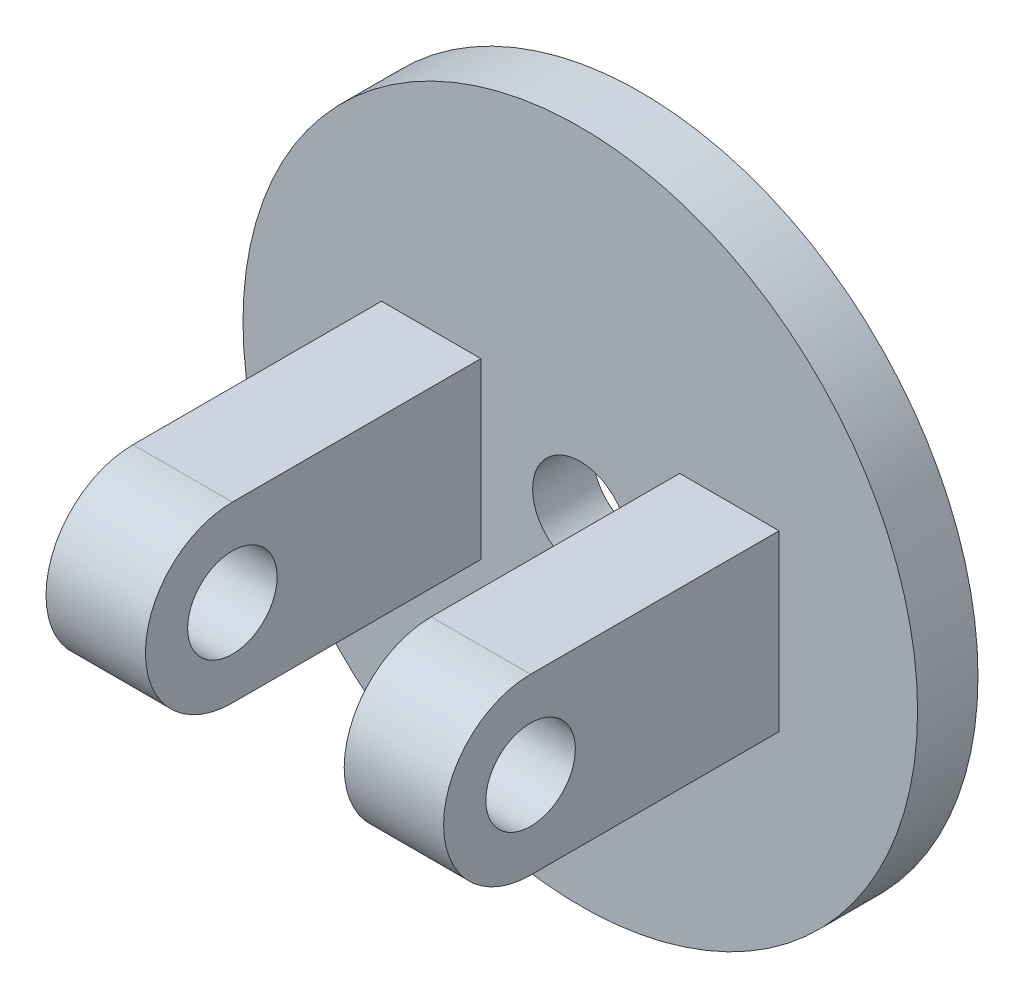
ISO-10303-21;
HEADER;
FILE_DESCRIPTION(('STEP AP214'),'2;1');
FILE_NAME('part.step','',(''),(''),'','','');
FILE_SCHEMA(('AUTOMOTIVE_DESIGN { 1 0 10303 214 1 1 1 1 }'));
ENDSEC;
DATA;
#1=APPLICATION_CONTEXT('core data for automotive mechanical design processes');
#2=APPLICATION_PROTOCOL_DEFINITION('international standard','automotive_design',2000,#1);
#3=PRODUCT_CONTEXT('',#1,'mechanical');
#4=PRODUCT('Part','Part','',(#3));
#5=PRODUCT_RELATED_PRODUCT_CATEGORY('part','',(#4));
#6=PRODUCT_DEFINITION_FORMATION('','',#4);
#7=PRODUCT_DEFINITION_CONTEXT('part definition',#1,'design');
#8=PRODUCT_DEFINITION('design','',#6,#7);
#9=PRODUCT_DEFINITION_SHAPE('','',#8);
#10=(LENGTH_UNIT() NAMED_UNIT(*) SI_UNIT(.MILLI.,.METRE.));
#11=(NAMED_UNIT(*) PLANE_ANGLE_UNIT() SI_UNIT($,.RADIAN.));
#12=(NAMED_UNIT(*) SI_UNIT($,.STERADIAN.) SOLID_ANGLE_UNIT());
#13=UNCERTAINTY_MEASURE_WITH_UNIT(LENGTH_MEASURE(1.E-05),#10,'distance_accuracy_value','');
#14=(GEOMETRIC_REPRESENTATION_CONTEXT(3) GLOBAL_UNCERTAINTY_ASSIGNED_CONTEXT((#13)) GLOBAL_UNIT_ASSIGNED_CONTEXT((#10,
#11,#12)) REPRESENTATION_CONTEXT('',''));
#15=CARTESIAN_POINT('',(0.,0.,0.));
#16=DIRECTION('',(0.,0.,1.));
#17=DIRECTION('',(1.,0.,0.));
#18=AXIS2_PLACEMENT_3D('',#15,#16,#17);
#19=CARTESIAN_POINT('',(0.,0.,-85.5416238437821));
#20=DIRECTION('',(0.,0.,-1.));
#21=DIRECTION('',(-1.,0.,0.));
#22=AXIS2_PLACEMENT_3D('',#19,#20,#21);
#23=CYLINDRICAL_SURFACE('',#22,67.8656020238754);
#24=CARTESIAN_POINT('',(0.,0.,18.4501541623844));
#25=DIRECTION('',(0.,0.,-1.));
#26=DIRECTION('',(-1.,0.,0.));
#27=AXIS2_PLACEMENT_3D('',#24,#25,#26);
#28=CIRCLE('',#27,67.8656020238754);
#29=CARTESIAN_POINT('',(-67.8656020238754,0.,18.4501541623844));
#30=VERTEX_POINT('',#29);
#31=EDGE_CURVE('E11',#30,#30,#28,.T.);
#32=ORIENTED_EDGE('',*,*,#31,.T.);
#33=EDGE_LOOP('',(#32));
#34=FACE_BOUND('',#33,.T.);
#35=CARTESIAN_POINT('',(0.,0.,6.29496402877701));
#36=DIRECTION('',(0.,0.,-1.));
#37=DIRECTION('',(-1.,0.,0.));
#38=AXIS2_PLACEMENT_3D('',#35,#36,#37);
#39=CIRCLE('',#38,67.8656020238754);
#40=CARTESIAN_POINT('',(-67.8656020238754,0.,6.29496402877701));
#41=VERTEX_POINT('',#40);
#42=EDGE_CURVE('E140',#41,#41,#39,.T.);
#43=ORIENTED_EDGE('',*,*,#42,.F.);
#44=EDGE_LOOP('',(#43));
#45=FACE_BOUND('',#44,.T.);
#46=ADVANCED_FACE('F38',(#34,#45),#23,.T.);
#47=CARTESIAN_POINT('',(0.,0.,40.));
#48=DIRECTION('',(0.,0.,-1.));
#49=DIRECTION('',(-1.,0.,0.));
#50=AXIS2_PLACEMENT_3D('',#47,#48,#49);
#51=CYLINDRICAL_SURFACE('',#50,9.58993583154363);
#52=CARTESIAN_POINT('',(0.,0.,18.4501541623844));
#53=DIRECTION('',(0.,0.,-1.));
#54=DIRECTION('',(-1.,0.,0.));
#55=AXIS2_PLACEMENT_3D('',#52,#53,#54);
#56=CIRCLE('',#55,9.58993583154363);
#57=CARTESIAN_POINT('',(-9.58993583154363,0.,18.4501541623844));
#58=VERTEX_POINT('',#57);
#59=EDGE_CURVE('E48',#58,#58,#56,.T.);
#60=ORIENTED_EDGE('',*,*,#59,.F.);
#61=EDGE_LOOP('',(#60));
#62=FACE_BOUND('',#61,.T.);
#63=CARTESIAN_POINT('',(0.,0.,6.29496402877702));
#64=DIRECTION('',(0.,0.,-1.));
#65=DIRECTION('',(-1.,0.,0.));
#66=AXIS2_PLACEMENT_3D('',#63,#64,#65);
#67=CIRCLE('',#66,9.58993583154363);
#68=CARTESIAN_POINT('',(-9.58993583154363,0.,6.29496402877702));
#69=VERTEX_POINT('',#68);
#70=EDGE_CURVE('E147',#69,#69,#67,.F.);
#71=ORIENTED_EDGE('',*,*,#70,.F.);
#72=EDGE_LOOP('',(#71));
#73=FACE_BOUND('',#72,.T.);
#74=ADVANCED_FACE('F254',(#62,#73),#51,.F.);
#75=CARTESIAN_POINT('',(0.,0.,18.4501541623844));
#76=DIRECTION('',(0.,0.,-1.));
#77=DIRECTION('',(-1.,0.,0.));
#78=AXIS2_PLACEMENT_3D('',#75,#76,#77);
#79=PLANE('',#78);
#80=DIRECTION('',(0.,-1.,0.));
#81=VECTOR('',#80,1.);
#82=CARTESIAN_POINT('',(-40.,-17.5,18.4501541623844));
#83=LINE('',#82,#81);
#84=CARTESIAN_POINT('',(-40.,17.5,18.4501541623844));
#85=VERTEX_POINT('',#84);
#86=CARTESIAN_POINT('',(-40.,-17.5,18.4501541623844));
#87=VERTEX_POINT('',#86);
#88=EDGE_CURVE('E123',#85,#87,#83,.T.);
#89=ORIENTED_EDGE('',*,*,#88,.F.);
#90=DIRECTION('',(-1.,0.,0.));
#91=VECTOR('',#90,1.);
#92=CARTESIAN_POINT('',(-40.,17.5,18.4501541623844));
#93=LINE('',#92,#91);
#94=CARTESIAN_POINT('',(-20.,17.5,18.4501541623844));
#95=VERTEX_POINT('',#94);
#96=EDGE_CURVE('E181',#95,#85,#93,.T.);
#97=ORIENTED_EDGE('',*,*,#96,.F.);
#98=DIRECTION('',(0.,1.,0.));
#99=VECTOR('',#98,1.);
#100=CARTESIAN_POINT('',(-20.,-17.5,18.4501541623844));
#101=LINE('',#100,#99);
#102=CARTESIAN_POINT('',(-20.,-17.5,18.4501541623844));
#103=VERTEX_POINT('',#102);
#104=EDGE_CURVE('E193',#103,#95,#101,.T.);
#105=ORIENTED_EDGE('',*,*,#104,.F.);
#106=DIRECTION('',(1.,0.,0.));
#107=VECTOR('',#106,1.);
#108=CARTESIAN_POINT('',(-40.,-17.5,18.4501541623844));
#109=LINE('',#108,#107);
#110=EDGE_CURVE('E189',#87,#103,#109,.T.);
#111=ORIENTED_EDGE('',*,*,#110,.F.);
#112=EDGE_LOOP('',(#89,#97,#105,#111));
#113=FACE_BOUND('',#112,.T.);
#114=ORIENTED_EDGE('',*,*,#59,.T.);
#115=EDGE_LOOP('',(#114));
#116=FACE_BOUND('',#115,.T.);
#117=ORIENTED_EDGE('',*,*,#31,.F.);
#118=EDGE_LOOP('',(#117));
#119=FACE_BOUND('',#118,.T.);
#120=DIRECTION('',(0.,1.,0.));
#121=VECTOR('',#120,1.);
#122=CARTESIAN_POINT('',(40.,17.5,18.4501541623844));
#123=LINE('',#122,#121);
#124=CARTESIAN_POINT('',(40.,-17.5,18.4501541623844));
#125=VERTEX_POINT('',#124);
#126=CARTESIAN_POINT('',(40.,17.5,18.4501541623844));
#127=VERTEX_POINT('',#126);
#128=EDGE_CURVE('E120',#125,#127,#123,.T.);
#129=ORIENTED_EDGE('',*,*,#128,.F.);
#130=DIRECTION('',(1.,0.,0.));
#131=VECTOR('',#130,1.);
#132=CARTESIAN_POINT('',(40.,-17.5,18.4501541623844));
#133=LINE('',#132,#131);
#134=CARTESIAN_POINT('',(20.,-17.5,18.4501541623844));
#135=VERTEX_POINT('',#134);
#136=EDGE_CURVE('E134',#135,#125,#133,.T.);
#137=ORIENTED_EDGE('',*,*,#136,.F.);
#138=DIRECTION('',(0.,-1.,0.));
#139=VECTOR('',#138,1.);
#140=CARTESIAN_POINT('',(20.,17.5,18.4501541623844));
#141=LINE('',#140,#139);
#142=CARTESIAN_POINT('',(20.,17.5,18.4501541623844));
#143=VERTEX_POINT('',#142);
#144=EDGE_CURVE('E66',#143,#135,#141,.T.);
#145=ORIENTED_EDGE('',*,*,#144,.F.);
#146=DIRECTION('',(-1.,0.,0.));
#147=VECTOR('',#146,1.);
#148=CARTESIAN_POINT('',(40.,17.5,18.4501541623844));
#149=LINE('',#148,#147);
#150=EDGE_CURVE('E59',#127,#143,#149,.T.);
#151=ORIENTED_EDGE('',*,*,#150,.F.);
#152=EDGE_LOOP('',(#129,#137,#145,#151));
#153=FACE_BOUND('',#152,.T.);
#154=ADVANCED_FACE('F40',(#113,#116,#119,#153),#79,.F.);
#155=CARTESIAN_POINT('',(-40.,-17.5,68.4501541623844));
#156=DIRECTION('',(1.,0.,0.));
#157=DIRECTION('',(0.,0.,-1.));
#158=AXIS2_PLACEMENT_3D('',#155,#156,#157);
#159=PLANE('',#158);
#160=CARTESIAN_POINT('',(-40.,0.,68.4501541623844));
#161=DIRECTION('',(1.,0.,0.));
#162=DIRECTION('',(0.,0.,-1.));
#163=AXIS2_PLACEMENT_3D('',#160,#161,#162);
#164=CIRCLE('',#163,9.);
#165=CARTESIAN_POINT('',(-40.,0.,59.4501541623844));
#166=VERTEX_POINT('',#165);
#167=EDGE_CURVE('E219',#166,#166,#164,.T.);
#168=ORIENTED_EDGE('',*,*,#167,.T.);
#169=EDGE_LOOP('',(#168));
#170=FACE_BOUND('',#169,.T.);
#171=DIRECTION('',(0.,0.,-1.));
#172=VECTOR('',#171,1.);
#173=CARTESIAN_POINT('',(-40.,-17.5,68.4501541623844));
#174=LINE('',#173,#172);
#175=CARTESIAN_POINT('',(-40.,-17.5,68.4501541623844));
#176=VERTEX_POINT('',#175);
#177=EDGE_CURVE('E211',#176,#87,#174,.T.);
#178=ORIENTED_EDGE('',*,*,#177,.F.);
#179=CARTESIAN_POINT('',(-40.,0.,68.4501541623844));
#180=DIRECTION('',(1.,0.,0.));
#181=DIRECTION('',(0.,0.,-1.));
#182=AXIS2_PLACEMENT_3D('',#179,#180,#181);
#183=CIRCLE('',#182,17.5);
#184=CARTESIAN_POINT('',(-40.,17.5,68.4501541623844));
#185=VERTEX_POINT('',#184);
#186=EDGE_CURVE('E150',#185,#176,#183,.T.);
#187=ORIENTED_EDGE('',*,*,#186,.F.);
#188=DIRECTION('',(0.,0.,-1.));
#189=VECTOR('',#188,1.);
#190=CARTESIAN_POINT('',(-40.,17.5,68.4501541623844));
#191=LINE('',#190,#189);
#192=EDGE_CURVE('E185',#185,#85,#191,.T.);
#193=ORIENTED_EDGE('',*,*,#192,.T.);
#194=ORIENTED_EDGE('',*,*,#88,.T.);
#195=EDGE_LOOP('',(#178,#187,#193,#194));
#196=FACE_BOUND('',#195,.T.);
#197=ADVANCED_FACE('F263',(#170,#196),#159,.F.);
#198=CARTESIAN_POINT('',(-40.,-17.5,68.4501541623844));
#199=DIRECTION('',(0.,1.,0.));
#200=DIRECTION('',(0.,0.,1.));
#201=AXIS2_PLACEMENT_3D('',#198,#199,#200);
#202=PLANE('',#201);
#203=ORIENTED_EDGE('',*,*,#110,.T.);
#204=DIRECTION('',(0.,0.,-1.));
#205=VECTOR('',#204,1.);
#206=CARTESIAN_POINT('',(-20.,-17.5,68.4501541623844));
#207=LINE('',#206,#205);
#208=CARTESIAN_POINT('',(-20.,-17.5,68.4501541623844));
#209=VERTEX_POINT('',#208);
#210=EDGE_CURVE('E207',#209,#103,#207,.T.);
#211=ORIENTED_EDGE('',*,*,#210,.F.);
#212=DIRECTION('',(1.,0.,0.));
#213=VECTOR('',#212,1.);
#214=CARTESIAN_POINT('',(-40.,-17.5,68.4501541623844));
#215=LINE('',#214,#213);
#216=EDGE_CURVE('E176',#176,#209,#215,.T.);
#217=ORIENTED_EDGE('',*,*,#216,.F.);
#218=ORIENTED_EDGE('',*,*,#177,.T.);
#219=EDGE_LOOP('',(#203,#211,#217,#218));
#220=FACE_BOUND('',#219,.T.);
#221=ADVANCED_FACE('F266',(#220),#202,.F.);
#222=CARTESIAN_POINT('',(-20.,-17.5,68.4501541623844));
#223=DIRECTION('',(-1.,0.,0.));
#224=DIRECTION('',(0.,0.,1.));
#225=AXIS2_PLACEMENT_3D('',#222,#223,#224);
#226=PLANE('',#225);
#227=CARTESIAN_POINT('',(-20.,0.,68.4501541623844));
#228=DIRECTION('',(-1.,0.,0.));
#229=DIRECTION('',(0.,0.,1.));
#230=AXIS2_PLACEMENT_3D('',#227,#228,#229);
#231=CIRCLE('',#230,9.);
#232=CARTESIAN_POINT('',(-20.,0.,77.4501541623844));
#233=VERTEX_POINT('',#232);
#234=EDGE_CURVE('E224',#233,#233,#231,.T.);
#235=ORIENTED_EDGE('',*,*,#234,.T.);
#236=EDGE_LOOP('',(#235));
#237=FACE_BOUND('',#236,.T.);
#238=DIRECTION('',(0.,0.,-1.));
#239=VECTOR('',#238,1.);
#240=CARTESIAN_POINT('',(-20.,17.5,68.4501541623844));
#241=LINE('',#240,#239);
#242=CARTESIAN_POINT('',(-20.,17.5,68.4501541623844));
#243=VERTEX_POINT('',#242);
#244=EDGE_CURVE('E203',#243,#95,#241,.T.);
#245=ORIENTED_EDGE('',*,*,#244,.F.);
#246=CARTESIAN_POINT('',(-20.,0.,68.4501541623844));
#247=DIRECTION('',(1.,0.,0.));
#248=DIRECTION('',(0.,0.,-1.));
#249=AXIS2_PLACEMENT_3D('',#246,#247,#248);
#250=CIRCLE('',#249,17.5);
#251=EDGE_CURVE('E143',#243,#209,#250,.T.);
#252=ORIENTED_EDGE('',*,*,#251,.T.);
#253=ORIENTED_EDGE('',*,*,#210,.T.);
#254=ORIENTED_EDGE('',*,*,#104,.T.);
#255=EDGE_LOOP('',(#245,#252,#253,#254));
#256=FACE_BOUND('',#255,.T.);
#257=ADVANCED_FACE('F269',(#237,#256),#226,.F.);
#258=CARTESIAN_POINT('',(-40.,17.5,68.4501541623844));
#259=DIRECTION('',(0.,-1.,0.));
#260=DIRECTION('',(0.,0.,-1.));
#261=AXIS2_PLACEMENT_3D('',#258,#259,#260);
#262=PLANE('',#261);
#263=ORIENTED_EDGE('',*,*,#96,.T.);
#264=ORIENTED_EDGE('',*,*,#192,.F.);
#265=DIRECTION('',(-1.,0.,0.));
#266=VECTOR('',#265,1.);
#267=CARTESIAN_POINT('',(-40.,17.5,68.4501541623844));
#268=LINE('',#267,#266);
#269=EDGE_CURVE('E180',#243,#185,#268,.T.);
#270=ORIENTED_EDGE('',*,*,#269,.F.);
#271=ORIENTED_EDGE('',*,*,#244,.T.);
#272=EDGE_LOOP('',(#263,#264,#270,#271));
#273=FACE_BOUND('',#272,.T.);
#274=ADVANCED_FACE('F273',(#273),#262,.F.);
#275=CARTESIAN_POINT('',(40.,17.5,68.4501541623844));
#276=DIRECTION('',(-1.,0.,0.));
#277=DIRECTION('',(0.,-1.,0.));
#278=AXIS2_PLACEMENT_3D('',#275,#276,#277);
#279=PLANE('',#278);
#280=CARTESIAN_POINT('',(40.,0.,68.4501541623844));
#281=DIRECTION('',(1.,0.,0.));
#282=DIRECTION('',(0.,0.,-1.));
#283=AXIS2_PLACEMENT_3D('',#280,#281,#282);
#284=CIRCLE('',#283,9.);
#285=CARTESIAN_POINT('',(40.,0.,59.4501541623844));
#286=VERTEX_POINT('',#285);
#287=EDGE_CURVE('E232',#286,#286,#284,.T.);
#288=ORIENTED_EDGE('',*,*,#287,.F.);
#289=EDGE_LOOP('',(#288));
#290=FACE_BOUND('',#289,.T.);
#291=DIRECTION('',(0.,0.,-1.));
#292=VECTOR('',#291,1.);
#293=CARTESIAN_POINT('',(40.,17.5,68.4501541623844));
#294=LINE('',#293,#292);
#295=CARTESIAN_POINT('',(40.,17.5,68.4501541623844));
#296=VERTEX_POINT('',#295);
#297=EDGE_CURVE('E114',#296,#127,#294,.T.);
#298=ORIENTED_EDGE('',*,*,#297,.F.);
#299=CARTESIAN_POINT('',(40.,0.,68.4501541623844));
#300=DIRECTION('',(1.,0.,0.));
#301=DIRECTION('',(0.,0.,-1.));
#302=AXIS2_PLACEMENT_3D('',#299,#300,#301);
#303=CIRCLE('',#302,17.5);
#304=CARTESIAN_POINT('',(40.,-17.5,68.4501541623844));
#305=VERTEX_POINT('',#304);
#306=EDGE_CURVE('E119',#296,#305,#303,.T.);
#307=ORIENTED_EDGE('',*,*,#306,.T.);
#308=DIRECTION('',(0.,0.,-1.));
#309=VECTOR('',#308,1.);
#310=CARTESIAN_POINT('',(40.,-17.5,68.4501541623844));
#311=LINE('',#310,#309);
#312=EDGE_CURVE('E158',#305,#125,#311,.T.);
#313=ORIENTED_EDGE('',*,*,#312,.T.);
#314=ORIENTED_EDGE('',*,*,#128,.T.);
#315=EDGE_LOOP('',(#298,#307,#313,#314));
#316=FACE_BOUND('',#315,.T.);
#317=ADVANCED_FACE('F116',(#290,#316),#279,.F.);
#318=CARTESIAN_POINT('',(40.,17.5,68.4501541623844));
#319=DIRECTION('',(0.,-1.,0.));
#320=DIRECTION('',(1.,0.,0.));
#321=AXIS2_PLACEMENT_3D('',#318,#319,#320);
#322=PLANE('',#321);
#323=ORIENTED_EDGE('',*,*,#150,.T.);
#324=DIRECTION('',(0.,0.,-1.));
#325=VECTOR('',#324,1.);
#326=CARTESIAN_POINT('',(20.,17.5,68.4501541623844));
#327=LINE('',#326,#325);
#328=CARTESIAN_POINT('',(20.,17.5,68.4501541623844));
#329=VERTEX_POINT('',#328);
#330=EDGE_CURVE('E124',#329,#143,#327,.T.);
#331=ORIENTED_EDGE('',*,*,#330,.F.);
#332=DIRECTION('',(-1.,0.,0.));
#333=VECTOR('',#332,1.);
#334=CARTESIAN_POINT('',(40.,17.5,68.4501541623844));
#335=LINE('',#334,#333);
#336=EDGE_CURVE('E127',#296,#329,#335,.T.);
#337=ORIENTED_EDGE('',*,*,#336,.F.);
#338=ORIENTED_EDGE('',*,*,#297,.T.);
#339=EDGE_LOOP('',(#323,#331,#337,#338));
#340=FACE_BOUND('',#339,.T.);
#341=ADVANCED_FACE('F128',(#340),#322,.F.);
#342=CARTESIAN_POINT('',(20.,17.5,68.4501541623844));
#343=DIRECTION('',(1.,0.,0.));
#344=DIRECTION('',(0.,1.,0.));
#345=AXIS2_PLACEMENT_3D('',#342,#343,#344);
#346=PLANE('',#345);
#347=CARTESIAN_POINT('',(20.,0.,68.4501541623844));
#348=DIRECTION('',(1.,0.,0.));
#349=DIRECTION('',(0.,1.,0.));
#350=AXIS2_PLACEMENT_3D('',#347,#348,#349);
#351=CIRCLE('',#350,9.);
#352=CARTESIAN_POINT('',(20.,9.00000000000001,68.4501541623844));
#353=VERTEX_POINT('',#352);
#354=EDGE_CURVE('E42',#353,#353,#351,.T.);
#355=ORIENTED_EDGE('',*,*,#354,.T.);
#356=EDGE_LOOP('',(#355));
#357=FACE_BOUND('',#356,.T.);
#358=DIRECTION('',(0.,0.,-1.));
#359=VECTOR('',#358,1.);
#360=CARTESIAN_POINT('',(20.,-17.5,68.4501541623844));
#361=LINE('',#360,#359);
#362=CARTESIAN_POINT('',(20.,-17.5,68.4501541623844));
#363=VERTEX_POINT('',#362);
#364=EDGE_CURVE('E170',#363,#135,#361,.T.);
#365=ORIENTED_EDGE('',*,*,#364,.F.);
#366=CARTESIAN_POINT('',(20.,0.,68.4501541623844));
#367=DIRECTION('',(1.,0.,0.));
#368=DIRECTION('',(0.,0.,-1.));
#369=AXIS2_PLACEMENT_3D('',#366,#367,#368);
#370=CIRCLE('',#369,17.5);
#371=EDGE_CURVE('E139',#329,#363,#370,.T.);
#372=ORIENTED_EDGE('',*,*,#371,.F.);
#373=ORIENTED_EDGE('',*,*,#330,.T.);
#374=ORIENTED_EDGE('',*,*,#144,.T.);
#375=EDGE_LOOP('',(#365,#372,#373,#374));
#376=FACE_BOUND('',#375,.T.);
#377=ADVANCED_FACE('F239',(#357,#376),#346,.F.);
#378=CARTESIAN_POINT('',(40.,-17.5,68.4501541623844));
#379=DIRECTION('',(0.,1.,0.));
#380=DIRECTION('',(-1.,0.,0.));
#381=AXIS2_PLACEMENT_3D('',#378,#379,#380);
#382=PLANE('',#381);
#383=ORIENTED_EDGE('',*,*,#136,.T.);
#384=ORIENTED_EDGE('',*,*,#312,.F.);
#385=DIRECTION('',(1.,0.,0.));
#386=VECTOR('',#385,1.);
#387=CARTESIAN_POINT('',(40.,-17.5,68.4501541623844));
#388=LINE('',#387,#386);
#389=EDGE_CURVE('E133',#363,#305,#388,.T.);
#390=ORIENTED_EDGE('',*,*,#389,.F.);
#391=ORIENTED_EDGE('',*,*,#364,.T.);
#392=EDGE_LOOP('',(#383,#384,#390,#391));
#393=FACE_BOUND('',#392,.T.);
#394=ADVANCED_FACE('F285',(#393),#382,.F.);
#395=CARTESIAN_POINT('',(-40.,0.,68.4501541623844));
#396=DIRECTION('',(1.,0.,0.));
#397=DIRECTION('',(0.,0.,-1.));
#398=AXIS2_PLACEMENT_3D('',#395,#396,#397);
#399=CYLINDRICAL_SURFACE('',#398,17.5);
#400=ORIENTED_EDGE('',*,*,#269,.T.);
#401=ORIENTED_EDGE('',*,*,#186,.T.);
#402=ORIENTED_EDGE('',*,*,#216,.T.);
#403=ORIENTED_EDGE('',*,*,#251,.F.);
#404=EDGE_LOOP('',(#400,#401,#402,#403));
#405=FACE_BOUND('',#404,.T.);
#406=ADVANCED_FACE('F288',(#405),#399,.T.);
#407=CARTESIAN_POINT('',(20.,0.,68.4501541623844));
#408=DIRECTION('',(1.,0.,0.));
#409=DIRECTION('',(0.,0.,-1.));
#410=AXIS2_PLACEMENT_3D('',#407,#408,#409);
#411=CYLINDRICAL_SURFACE('',#410,17.5);
#412=ORIENTED_EDGE('',*,*,#336,.T.);
#413=ORIENTED_EDGE('',*,*,#371,.T.);
#414=ORIENTED_EDGE('',*,*,#389,.T.);
#415=ORIENTED_EDGE('',*,*,#306,.F.);
#416=EDGE_LOOP('',(#412,#413,#414,#415));
#417=FACE_BOUND('',#416,.T.);
#418=ADVANCED_FACE('F137',(#417),#411,.T.);
#419=CARTESIAN_POINT('',(0.,0.,6.29496402877702));
#420=DIRECTION('',(0.,0.,-1.));
#421=DIRECTION('',(-1.,0.,0.));
#422=AXIS2_PLACEMENT_3D('',#419,#420,#421);
#423=PLANE('',#422);
#424=ORIENTED_EDGE('',*,*,#70,.T.);
#425=EDGE_LOOP('',(#424));
#426=FACE_BOUND('',#425,.T.);
#427=ORIENTED_EDGE('',*,*,#42,.T.);
#428=EDGE_LOOP('',(#427));
#429=FACE_BOUND('',#428,.T.);
#430=ADVANCED_FACE('F245',(#426,#429),#423,.T.);
#431=CARTESIAN_POINT('',(-50.,0.,68.4501541623844));
#432=DIRECTION('',(1.,0.,0.));
#433=DIRECTION('',(0.,0.,-1.));
#434=AXIS2_PLACEMENT_3D('',#431,#432,#433);
#435=CYLINDRICAL_SURFACE('',#434,9.);
#436=ORIENTED_EDGE('',*,*,#287,.T.);
#437=EDGE_LOOP('',(#436));
#438=FACE_BOUND('',#437,.T.);
#439=ORIENTED_EDGE('',*,*,#354,.F.);
#440=EDGE_LOOP('',(#439));
#441=FACE_BOUND('',#440,.T.);
#442=ADVANCED_FACE('F242',(#438,#441),#435,.F.);
#443=ORIENTED_EDGE('',*,*,#234,.F.);
#444=EDGE_LOOP('',(#443));
#445=FACE_BOUND('',#444,.T.);
#446=ORIENTED_EDGE('',*,*,#167,.F.);
#447=EDGE_LOOP('',(#446));
#448=FACE_BOUND('',#447,.T.);
#449=ADVANCED_FACE('F244',(#445,#448),#435,.F.);
#450=CLOSED_SHELL('',(#46,#74,#154,#197,#221,#257,#274,#317,#341,#377,#394,#406,#418,#430,#442,#449));
#451=MANIFOLD_SOLID_BREP('B2',#450);
#452=ADVANCED_BREP_SHAPE_REPRESENTATION('',(#18,#451),#14);
#453=SHAPE_DEFINITION_REPRESENTATION(#9,#452);
ENDSEC;
END-ISO-10303-21;
